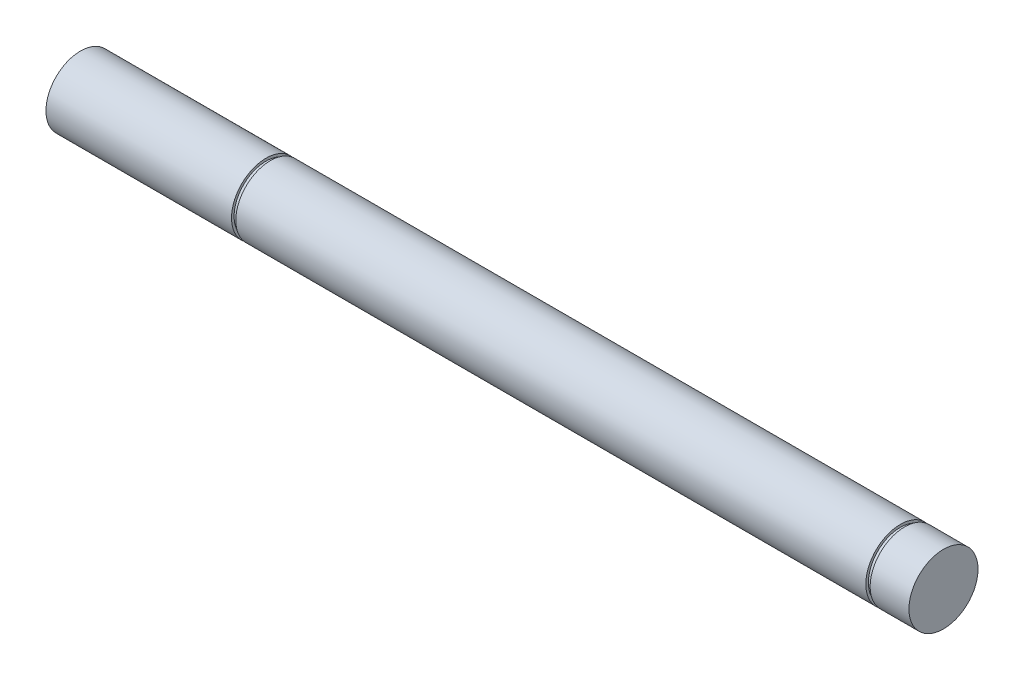
ISO-10303-21;
HEADER;
FILE_DESCRIPTION(('STEP AP214'),'2;1');
FILE_NAME('part.step','',(''),(''),'','','');
FILE_SCHEMA(('AUTOMOTIVE_DESIGN { 1 0 10303 214 1 1 1 1 }'));
ENDSEC;
DATA;
#1=APPLICATION_CONTEXT('core data for automotive mechanical design processes');
#2=APPLICATION_PROTOCOL_DEFINITION('international standard','automotive_design',2000,#1);
#3=PRODUCT_CONTEXT('',#1,'mechanical');
#4=PRODUCT('Part','Part','',(#3));
#5=PRODUCT_RELATED_PRODUCT_CATEGORY('part','',(#4));
#6=PRODUCT_DEFINITION_FORMATION('','',#4);
#7=PRODUCT_DEFINITION_CONTEXT('part definition',#1,'design');
#8=PRODUCT_DEFINITION('design','',#6,#7);
#9=PRODUCT_DEFINITION_SHAPE('','',#8);
#10=(LENGTH_UNIT() NAMED_UNIT(*) SI_UNIT(.MILLI.,.METRE.));
#11=(NAMED_UNIT(*) PLANE_ANGLE_UNIT() SI_UNIT($,.RADIAN.));
#12=(NAMED_UNIT(*) SI_UNIT($,.STERADIAN.) SOLID_ANGLE_UNIT());
#13=UNCERTAINTY_MEASURE_WITH_UNIT(LENGTH_MEASURE(1.E-05),#10,'distance_accuracy_value','');
#14=(GEOMETRIC_REPRESENTATION_CONTEXT(3) GLOBAL_UNCERTAINTY_ASSIGNED_CONTEXT((#13)) GLOBAL_UNIT_ASSIGNED_CONTEXT((#10,
#11,#12)) REPRESENTATION_CONTEXT('',''));
#15=CARTESIAN_POINT('',(0.,0.,0.));
#16=DIRECTION('',(0.,0.,1.));
#17=DIRECTION('',(1.,0.,0.));
#18=AXIS2_PLACEMENT_3D('',#15,#16,#17);
#19=CARTESIAN_POINT('',(50.,0.,0.));
#20=DIRECTION('',(-1.,0.,0.));
#21=DIRECTION('',(0.,0.,1.));
#22=AXIS2_PLACEMENT_3D('',#19,#20,#21);
#23=CYLINDRICAL_SURFACE('',#22,4.);
#24=CARTESIAN_POINT('',(-28.,0.,0.));
#25=DIRECTION('',(1.,0.,0.));
#26=DIRECTION('',(0.,0.,-1.));
#27=AXIS2_PLACEMENT_3D('',#24,#25,#26);
#28=CIRCLE('',#27,4.);
#29=CARTESIAN_POINT('',(-28.,0.,-4.));
#30=VERTEX_POINT('',#29);
#31=EDGE_CURVE('E60',#30,#30,#28,.T.);
#32=ORIENTED_EDGE('',*,*,#31,.T.);
#33=EDGE_LOOP('',(#32));
#34=FACE_BOUND('',#33,.T.);
#35=CARTESIAN_POINT('',(45.,0.,0.));
#36=DIRECTION('',(-1.,0.,0.));
#37=DIRECTION('',(0.,0.,1.));
#38=AXIS2_PLACEMENT_3D('',#35,#36,#37);
#39=CIRCLE('',#38,4.);
#40=CARTESIAN_POINT('',(45.,0.,4.));
#41=VERTEX_POINT('',#40);
#42=EDGE_CURVE('E51',#41,#41,#39,.T.);
#43=ORIENTED_EDGE('',*,*,#42,.T.);
#44=EDGE_LOOP('',(#43));
#45=FACE_BOUND('',#44,.T.);
#46=ADVANCED_FACE('F31',(#34,#45),#23,.T.);
#47=CARTESIAN_POINT('',(45.,4.,0.));
#48=DIRECTION('',(1.,0.,0.));
#49=DIRECTION('',(0.,0.,-1.));
#50=AXIS2_PLACEMENT_3D('',#47,#48,#49);
#51=PLANE('',#50);
#52=CARTESIAN_POINT('',(45.,0.,0.));
#53=DIRECTION('',(-1.,0.,0.));
#54=DIRECTION('',(0.,0.,1.));
#55=AXIS2_PLACEMENT_3D('',#52,#53,#54);
#56=CIRCLE('',#55,3.7);
#57=CARTESIAN_POINT('',(45.,0.,3.7));
#58=VERTEX_POINT('',#57);
#59=EDGE_CURVE('E41',#58,#58,#56,.T.);
#60=ORIENTED_EDGE('',*,*,#59,.T.);
#61=EDGE_LOOP('',(#60));
#62=FACE_BOUND('',#61,.T.);
#63=ORIENTED_EDGE('',*,*,#42,.F.);
#64=EDGE_LOOP('',(#63));
#65=FACE_BOUND('',#64,.T.);
#66=ADVANCED_FACE('F86',(#62,#65),#51,.T.);
#67=CARTESIAN_POINT('',(0.,0.,0.));
#68=DIRECTION('',(-1.,0.,0.));
#69=DIRECTION('',(0.,0.,1.));
#70=AXIS2_PLACEMENT_3D('',#67,#68,#69);
#71=CYLINDRICAL_SURFACE('',#70,3.7);
#72=CARTESIAN_POINT('',(45.5,0.,0.));
#73=DIRECTION('',(-1.,0.,0.));
#74=DIRECTION('',(0.,0.,1.));
#75=AXIS2_PLACEMENT_3D('',#72,#73,#74);
#76=CIRCLE('',#75,3.7);
#77=CARTESIAN_POINT('',(45.5,0.,3.7));
#78=VERTEX_POINT('',#77);
#79=EDGE_CURVE('E45',#78,#78,#76,.T.);
#80=ORIENTED_EDGE('',*,*,#79,.T.);
#81=EDGE_LOOP('',(#80));
#82=FACE_BOUND('',#81,.T.);
#83=ORIENTED_EDGE('',*,*,#59,.F.);
#84=EDGE_LOOP('',(#83));
#85=FACE_BOUND('',#84,.T.);
#86=ADVANCED_FACE('F91',(#82,#85),#71,.T.);
#87=CARTESIAN_POINT('',(45.5,4.,0.));
#88=DIRECTION('',(-1.,0.,0.));
#89=DIRECTION('',(0.,0.,1.));
#90=AXIS2_PLACEMENT_3D('',#87,#88,#89);
#91=PLANE('',#90);
#92=CARTESIAN_POINT('',(45.5,0.,0.));
#93=DIRECTION('',(-1.,0.,0.));
#94=DIRECTION('',(0.,0.,1.));
#95=AXIS2_PLACEMENT_3D('',#92,#93,#94);
#96=CIRCLE('',#95,4.);
#97=CARTESIAN_POINT('',(45.5,0.,4.));
#98=VERTEX_POINT('',#97);
#99=EDGE_CURVE('E48',#98,#98,#96,.T.);
#100=ORIENTED_EDGE('',*,*,#99,.T.);
#101=EDGE_LOOP('',(#100));
#102=FACE_BOUND('',#101,.T.);
#103=ORIENTED_EDGE('',*,*,#79,.F.);
#104=EDGE_LOOP('',(#103));
#105=FACE_BOUND('',#104,.T.);
#106=ADVANCED_FACE('F104',(#102,#105),#91,.T.);
#107=CARTESIAN_POINT('',(50.,0.,0.));
#108=DIRECTION('',(1.,0.,0.));
#109=DIRECTION('',(0.,0.,-1.));
#110=AXIS2_PLACEMENT_3D('',#107,#108,#109);
#111=PLANE('',#110);
#112=CARTESIAN_POINT('',(50.,0.,0.));
#113=DIRECTION('',(1.,0.,0.));
#114=DIRECTION('',(0.,0.,-1.));
#115=AXIS2_PLACEMENT_3D('',#112,#113,#114);
#116=CIRCLE('',#115,4.);
#117=CARTESIAN_POINT('',(50.,0.,-4.));
#118=VERTEX_POINT('',#117);
#119=EDGE_CURVE('E10',#118,#118,#116,.T.);
#120=ORIENTED_EDGE('',*,*,#119,.T.);
#121=EDGE_LOOP('',(#120));
#122=FACE_BOUND('',#121,.T.);
#123=ADVANCED_FACE('F96',(#122),#111,.T.);
#124=ORIENTED_EDGE('',*,*,#119,.F.);
#125=EDGE_LOOP('',(#124));
#126=FACE_BOUND('',#125,.T.);
#127=ORIENTED_EDGE('',*,*,#99,.F.);
#128=EDGE_LOOP('',(#127));
#129=FACE_BOUND('',#128,.T.);
#130=ADVANCED_FACE('F73',(#126,#129),#23,.T.);
#131=CARTESIAN_POINT('',(-28.5,4.,0.));
#132=DIRECTION('',(-1.,0.,0.));
#133=DIRECTION('',(0.,0.,1.));
#134=AXIS2_PLACEMENT_3D('',#131,#132,#133);
#135=PLANE('',#134);
#136=CARTESIAN_POINT('',(-28.5,0.,0.));
#137=DIRECTION('',(1.,0.,0.));
#138=DIRECTION('',(0.,0.,-1.));
#139=AXIS2_PLACEMENT_3D('',#136,#137,#138);
#140=CIRCLE('',#139,3.7);
#141=CARTESIAN_POINT('',(-28.5,0.,-3.7));
#142=VERTEX_POINT('',#141);
#143=EDGE_CURVE('E54',#142,#142,#140,.T.);
#144=ORIENTED_EDGE('',*,*,#143,.F.);
#145=EDGE_LOOP('',(#144));
#146=FACE_BOUND('',#145,.T.);
#147=CARTESIAN_POINT('',(-28.5,0.,0.));
#148=DIRECTION('',(1.,0.,0.));
#149=DIRECTION('',(0.,0.,-1.));
#150=AXIS2_PLACEMENT_3D('',#147,#148,#149);
#151=CIRCLE('',#150,4.);
#152=CARTESIAN_POINT('',(-28.5,0.,-4.));
#153=VERTEX_POINT('',#152);
#154=EDGE_CURVE('E63',#153,#153,#151,.T.);
#155=ORIENTED_EDGE('',*,*,#154,.T.);
#156=EDGE_LOOP('',(#155));
#157=FACE_BOUND('',#156,.T.);
#158=ADVANCED_FACE('F67',(#146,#157),#135,.F.);
#159=CARTESIAN_POINT('',(0.,0.,0.));
#160=DIRECTION('',(1.,0.,0.));
#161=DIRECTION('',(0.,0.,-1.));
#162=AXIS2_PLACEMENT_3D('',#159,#160,#161);
#163=CYLINDRICAL_SURFACE('',#162,3.7);
#164=CARTESIAN_POINT('',(-28.,0.,0.));
#165=DIRECTION('',(1.,0.,0.));
#166=DIRECTION('',(0.,0.,-1.));
#167=AXIS2_PLACEMENT_3D('',#164,#165,#166);
#168=CIRCLE('',#167,3.7);
#169=CARTESIAN_POINT('',(-28.,0.,-3.7));
#170=VERTEX_POINT('',#169);
#171=EDGE_CURVE('E57',#170,#170,#168,.T.);
#172=ORIENTED_EDGE('',*,*,#171,.F.);
#173=EDGE_LOOP('',(#172));
#174=FACE_BOUND('',#173,.T.);
#175=ORIENTED_EDGE('',*,*,#143,.T.);
#176=EDGE_LOOP('',(#175));
#177=FACE_BOUND('',#176,.T.);
#178=ADVANCED_FACE('F81',(#174,#177),#163,.T.);
#179=CARTESIAN_POINT('',(-28.,4.,0.));
#180=DIRECTION('',(1.,0.,0.));
#181=DIRECTION('',(0.,0.,-1.));
#182=AXIS2_PLACEMENT_3D('',#179,#180,#181);
#183=PLANE('',#182);
#184=ORIENTED_EDGE('',*,*,#31,.F.);
#185=EDGE_LOOP('',(#184));
#186=FACE_BOUND('',#185,.T.);
#187=ORIENTED_EDGE('',*,*,#171,.T.);
#188=EDGE_LOOP('',(#187));
#189=FACE_BOUND('',#188,.T.);
#190=ADVANCED_FACE('F77',(#186,#189),#183,.F.);
#191=CARTESIAN_POINT('',(-50.,0.,0.));
#192=DIRECTION('',(1.,0.,0.));
#193=DIRECTION('',(0.,0.,-1.));
#194=AXIS2_PLACEMENT_3D('',#191,#192,#193);
#195=PLANE('',#194);
#196=CARTESIAN_POINT('',(-50.,0.,0.));
#197=DIRECTION('',(1.,0.,0.));
#198=DIRECTION('',(0.,0.,-1.));
#199=AXIS2_PLACEMENT_3D('',#196,#197,#198);
#200=CIRCLE('',#199,4.);
#201=CARTESIAN_POINT('',(-50.,0.,-4.));
#202=VERTEX_POINT('',#201);
#203=EDGE_CURVE('E34',#202,#202,#200,.T.);
#204=ORIENTED_EDGE('',*,*,#203,.F.);
#205=EDGE_LOOP('',(#204));
#206=FACE_BOUND('',#205,.T.);
#207=ADVANCED_FACE('F72',(#206),#195,.F.);
#208=ORIENTED_EDGE('',*,*,#154,.F.);
#209=EDGE_LOOP('',(#208));
#210=FACE_BOUND('',#209,.T.);
#211=ORIENTED_EDGE('',*,*,#203,.T.);
#212=EDGE_LOOP('',(#211));
#213=FACE_BOUND('',#212,.T.);
#214=ADVANCED_FACE('F69',(#210,#213),#23,.T.);
#215=CLOSED_SHELL('',(#46,#66,#86,#106,#123,#130,#158,#178,#190,#207,#214));
#216=MANIFOLD_SOLID_BREP('B2',#215);
#217=ADVANCED_BREP_SHAPE_REPRESENTATION('',(#18,#216),#14);
#218=SHAPE_DEFINITION_REPRESENTATION(#9,#217);
ENDSEC;
END-ISO-10303-21;
